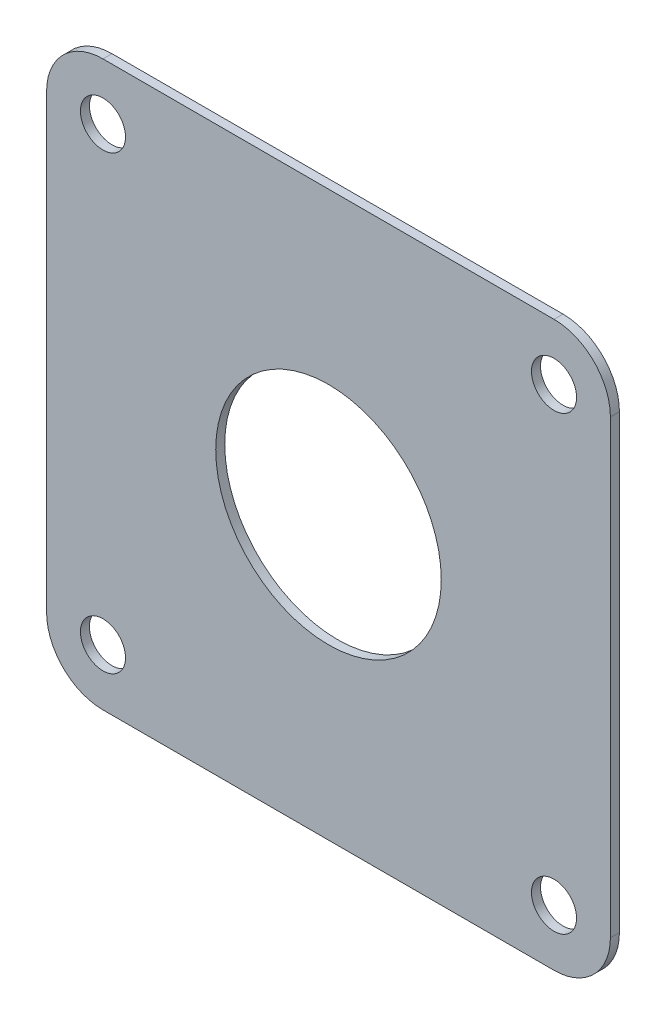
ISO-10303-21;
HEADER;
FILE_DESCRIPTION(('STEP AP214'),'2;1');
FILE_NAME('part.step','',(''),(''),'','','');
FILE_SCHEMA(('AUTOMOTIVE_DESIGN { 1 0 10303 214 1 1 1 1 }'));
ENDSEC;
DATA;
#1=APPLICATION_CONTEXT('core data for automotive mechanical design processes');
#2=APPLICATION_PROTOCOL_DEFINITION('international standard','automotive_design',2000,#1);
#3=PRODUCT_CONTEXT('',#1,'mechanical');
#4=PRODUCT('Part','Part','',(#3));
#5=PRODUCT_RELATED_PRODUCT_CATEGORY('part','',(#4));
#6=PRODUCT_DEFINITION_FORMATION('','',#4);
#7=PRODUCT_DEFINITION_CONTEXT('part definition',#1,'design');
#8=PRODUCT_DEFINITION('design','',#6,#7);
#9=PRODUCT_DEFINITION_SHAPE('','',#8);
#10=(LENGTH_UNIT() NAMED_UNIT(*) SI_UNIT(.MILLI.,.METRE.));
#11=(NAMED_UNIT(*) PLANE_ANGLE_UNIT() SI_UNIT($,.RADIAN.));
#12=(NAMED_UNIT(*) SI_UNIT($,.STERADIAN.) SOLID_ANGLE_UNIT());
#13=UNCERTAINTY_MEASURE_WITH_UNIT(LENGTH_MEASURE(1.E-05),#10,'distance_accuracy_value','');
#14=(GEOMETRIC_REPRESENTATION_CONTEXT(3) GLOBAL_UNCERTAINTY_ASSIGNED_CONTEXT((#13)) GLOBAL_UNIT_ASSIGNED_CONTEXT((#10,
#11,#12)) REPRESENTATION_CONTEXT('',''));
#15=CARTESIAN_POINT('',(0.,0.,0.));
#16=DIRECTION('',(0.,0.,1.));
#17=DIRECTION('',(1.,0.,0.));
#18=AXIS2_PLACEMENT_3D('',#15,#16,#17);
#19=CARTESIAN_POINT('',(25.,25.,0.8));
#20=DIRECTION('',(-1.,0.,0.));
#21=DIRECTION('',(0.,-1.,0.));
#22=AXIS2_PLACEMENT_3D('',#19,#20,#21);
#23=PLANE('',#22);
#24=DIRECTION('',(0.,1.,0.));
#25=VECTOR('',#24,1.);
#26=CARTESIAN_POINT('',(25.,25.,0.8));
#27=LINE('',#26,#25);
#28=CARTESIAN_POINT('',(25.,-20.,0.8));
#29=VERTEX_POINT('',#28);
#30=CARTESIAN_POINT('',(25.,20.,0.8));
#31=VERTEX_POINT('',#30);
#32=EDGE_CURVE('E128',#29,#31,#27,.T.);
#33=ORIENTED_EDGE('',*,*,#32,.F.);
#34=DIRECTION('',(0.,0.,-1.));
#35=VECTOR('',#34,1.);
#36=CARTESIAN_POINT('',(25.,-20.,0.8));
#37=LINE('',#36,#35);
#38=CARTESIAN_POINT('',(25.,-20.,0.));
#39=VERTEX_POINT('',#38);
#40=EDGE_CURVE('E154',#29,#39,#37,.T.);
#41=ORIENTED_EDGE('',*,*,#40,.T.);
#42=DIRECTION('',(0.,1.,0.));
#43=VECTOR('',#42,1.);
#44=CARTESIAN_POINT('',(25.,25.,0.));
#45=LINE('',#44,#43);
#46=CARTESIAN_POINT('',(25.,20.,0.));
#47=VERTEX_POINT('',#46);
#48=EDGE_CURVE('E163',#39,#47,#45,.T.);
#49=ORIENTED_EDGE('',*,*,#48,.T.);
#50=DIRECTION('',(0.,0.,-1.));
#51=VECTOR('',#50,1.);
#52=CARTESIAN_POINT('',(25.,20.,0.8));
#53=LINE('',#52,#51);
#54=EDGE_CURVE('E152',#47,#31,#53,.F.);
#55=ORIENTED_EDGE('',*,*,#54,.T.);
#56=EDGE_LOOP('',(#33,#41,#49,#55));
#57=FACE_BOUND('',#56,.T.);
#58=ADVANCED_FACE('F35',(#57),#23,.F.);
#59=CARTESIAN_POINT('',(-25.,25.,0.8));
#60=DIRECTION('',(0.,-1.,0.));
#61=DIRECTION('',(0.,0.,-1.));
#62=AXIS2_PLACEMENT_3D('',#59,#60,#61);
#63=PLANE('',#62);
#64=DIRECTION('',(-1.,0.,0.));
#65=VECTOR('',#64,1.);
#66=CARTESIAN_POINT('',(-25.,25.,0.8));
#67=LINE('',#66,#65);
#68=CARTESIAN_POINT('',(20.,25.,0.8));
#69=VERTEX_POINT('',#68);
#70=CARTESIAN_POINT('',(-20.,25.,0.8));
#71=VERTEX_POINT('',#70);
#72=EDGE_CURVE('E131',#69,#71,#67,.T.);
#73=ORIENTED_EDGE('',*,*,#72,.F.);
#74=DIRECTION('',(0.,0.,-1.));
#75=VECTOR('',#74,1.);
#76=CARTESIAN_POINT('',(20.,25.,0.8));
#77=LINE('',#76,#75);
#78=CARTESIAN_POINT('',(20.,25.,0.));
#79=VERTEX_POINT('',#78);
#80=EDGE_CURVE('E43',#69,#79,#77,.T.);
#81=ORIENTED_EDGE('',*,*,#80,.T.);
#82=DIRECTION('',(-1.,0.,0.));
#83=VECTOR('',#82,1.);
#84=CARTESIAN_POINT('',(-25.,25.,0.));
#85=LINE('',#84,#83);
#86=CARTESIAN_POINT('',(-20.,25.,0.));
#87=VERTEX_POINT('',#86);
#88=EDGE_CURVE('E133',#79,#87,#85,.T.);
#89=ORIENTED_EDGE('',*,*,#88,.T.);
#90=DIRECTION('',(0.,0.,-1.));
#91=VECTOR('',#90,1.);
#92=CARTESIAN_POINT('',(-20.,25.,0.8));
#93=LINE('',#92,#91);
#94=EDGE_CURVE('E50',#87,#71,#93,.F.);
#95=ORIENTED_EDGE('',*,*,#94,.T.);
#96=EDGE_LOOP('',(#73,#81,#89,#95));
#97=FACE_BOUND('',#96,.T.);
#98=ADVANCED_FACE('F160',(#97),#63,.F.);
#99=CARTESIAN_POINT('',(-25.,25.,0.8));
#100=DIRECTION('',(1.,0.,0.));
#101=DIRECTION('',(0.,1.,0.));
#102=AXIS2_PLACEMENT_3D('',#99,#100,#101);
#103=PLANE('',#102);
#104=DIRECTION('',(0.,-1.,0.));
#105=VECTOR('',#104,1.);
#106=CARTESIAN_POINT('',(-25.,25.,0.));
#107=LINE('',#106,#105);
#108=CARTESIAN_POINT('',(-25.,20.,0.));
#109=VERTEX_POINT('',#108);
#110=CARTESIAN_POINT('',(-25.,-20.,0.));
#111=VERTEX_POINT('',#110);
#112=EDGE_CURVE('E129',#109,#111,#107,.T.);
#113=ORIENTED_EDGE('',*,*,#112,.T.);
#114=DIRECTION('',(0.,0.,-1.));
#115=VECTOR('',#114,1.);
#116=CARTESIAN_POINT('',(-25.,-20.,0.8));
#117=LINE('',#116,#115);
#118=CARTESIAN_POINT('',(-25.,-20.,0.8));
#119=VERTEX_POINT('',#118);
#120=EDGE_CURVE('E107',#111,#119,#117,.F.);
#121=ORIENTED_EDGE('',*,*,#120,.T.);
#122=DIRECTION('',(0.,-1.,0.));
#123=VECTOR('',#122,1.);
#124=CARTESIAN_POINT('',(-25.,25.,0.8));
#125=LINE('',#124,#123);
#126=CARTESIAN_POINT('',(-25.,20.,0.8));
#127=VERTEX_POINT('',#126);
#128=EDGE_CURVE('E168',#127,#119,#125,.T.);
#129=ORIENTED_EDGE('',*,*,#128,.F.);
#130=DIRECTION('',(0.,0.,-1.));
#131=VECTOR('',#130,1.);
#132=CARTESIAN_POINT('',(-25.,20.,0.8));
#133=LINE('',#132,#131);
#134=EDGE_CURVE('E112',#127,#109,#133,.T.);
#135=ORIENTED_EDGE('',*,*,#134,.T.);
#136=EDGE_LOOP('',(#113,#121,#129,#135));
#137=FACE_BOUND('',#136,.T.);
#138=ADVANCED_FACE('F279',(#137),#103,.F.);
#139=CARTESIAN_POINT('',(-25.,-25.,0.8));
#140=DIRECTION('',(0.,1.,0.));
#141=DIRECTION('',(0.,0.,1.));
#142=AXIS2_PLACEMENT_3D('',#139,#140,#141);
#143=PLANE('',#142);
#144=DIRECTION('',(1.,0.,0.));
#145=VECTOR('',#144,1.);
#146=CARTESIAN_POINT('',(-25.,-25.,0.8));
#147=LINE('',#146,#145);
#148=CARTESIAN_POINT('',(-20.,-25.,0.8));
#149=VERTEX_POINT('',#148);
#150=CARTESIAN_POINT('',(20.,-25.,0.8));
#151=VERTEX_POINT('',#150);
#152=EDGE_CURVE('E122',#149,#151,#147,.T.);
#153=ORIENTED_EDGE('',*,*,#152,.F.);
#154=DIRECTION('',(0.,0.,-1.));
#155=VECTOR('',#154,1.);
#156=CARTESIAN_POINT('',(-20.,-25.,0.8));
#157=LINE('',#156,#155);
#158=CARTESIAN_POINT('',(-20.,-25.,0.));
#159=VERTEX_POINT('',#158);
#160=EDGE_CURVE('E106',#149,#159,#157,.T.);
#161=ORIENTED_EDGE('',*,*,#160,.T.);
#162=DIRECTION('',(1.,0.,0.));
#163=VECTOR('',#162,1.);
#164=CARTESIAN_POINT('',(-25.,-25.,0.));
#165=LINE('',#164,#163);
#166=CARTESIAN_POINT('',(20.,-25.,0.));
#167=VERTEX_POINT('',#166);
#168=EDGE_CURVE('E119',#159,#167,#165,.T.);
#169=ORIENTED_EDGE('',*,*,#168,.T.);
#170=DIRECTION('',(0.,0.,-1.));
#171=VECTOR('',#170,1.);
#172=CARTESIAN_POINT('',(20.,-25.,0.8));
#173=LINE('',#172,#171);
#174=EDGE_CURVE('E124',#167,#151,#173,.F.);
#175=ORIENTED_EDGE('',*,*,#174,.T.);
#176=EDGE_LOOP('',(#153,#161,#169,#175));
#177=FACE_BOUND('',#176,.T.);
#178=ADVANCED_FACE('F118',(#177),#143,.F.);
#179=CARTESIAN_POINT('',(0.,0.,0.8));
#180=DIRECTION('',(0.,0.,1.));
#181=DIRECTION('',(1.,0.,0.));
#182=AXIS2_PLACEMENT_3D('',#179,#180,#181);
#183=PLANE('',#182);
#184=CARTESIAN_POINT('',(0.,0.,0.8));
#185=DIRECTION('',(0.,0.,-1.));
#186=DIRECTION('',(-1.,0.,0.));
#187=AXIS2_PLACEMENT_3D('',#184,#185,#186);
#188=CIRCLE('',#187,10.);
#189=CARTESIAN_POINT('',(-10.,0.,0.8));
#190=VERTEX_POINT('',#189);
#191=EDGE_CURVE('E202',#190,#190,#188,.T.);
#192=ORIENTED_EDGE('',*,*,#191,.T.);
#193=EDGE_LOOP('',(#192));
#194=FACE_BOUND('',#193,.T.);
#195=CARTESIAN_POINT('',(20.,-20.,0.8));
#196=DIRECTION('',(0.,0.,-1.));
#197=DIRECTION('',(-1.,0.,0.));
#198=AXIS2_PLACEMENT_3D('',#195,#196,#197);
#199=CIRCLE('',#198,2.);
#200=CARTESIAN_POINT('',(18.,-20.,0.8));
#201=VERTEX_POINT('',#200);
#202=EDGE_CURVE('E181',#201,#201,#199,.T.);
#203=ORIENTED_EDGE('',*,*,#202,.T.);
#204=EDGE_LOOP('',(#203));
#205=FACE_BOUND('',#204,.T.);
#206=CARTESIAN_POINT('',(-20.,-20.,0.8));
#207=DIRECTION('',(0.,0.,-1.));
#208=DIRECTION('',(-1.,0.,0.));
#209=AXIS2_PLACEMENT_3D('',#206,#207,#208);
#210=CIRCLE('',#209,2.);
#211=CARTESIAN_POINT('',(-22.,-20.,0.8));
#212=VERTEX_POINT('',#211);
#213=EDGE_CURVE('E188',#212,#212,#210,.T.);
#214=ORIENTED_EDGE('',*,*,#213,.T.);
#215=EDGE_LOOP('',(#214));
#216=FACE_BOUND('',#215,.T.);
#217=CARTESIAN_POINT('',(-20.,20.,0.8));
#218=DIRECTION('',(0.,0.,-1.));
#219=DIRECTION('',(-1.,0.,0.));
#220=AXIS2_PLACEMENT_3D('',#217,#218,#219);
#221=CIRCLE('',#220,2.);
#222=CARTESIAN_POINT('',(-22.,20.,0.8));
#223=VERTEX_POINT('',#222);
#224=EDGE_CURVE('E175',#223,#223,#221,.T.);
#225=ORIENTED_EDGE('',*,*,#224,.T.);
#226=EDGE_LOOP('',(#225));
#227=FACE_BOUND('',#226,.T.);
#228=CARTESIAN_POINT('',(20.,20.,0.8));
#229=DIRECTION('',(0.,0.,-1.));
#230=DIRECTION('',(-1.,0.,0.));
#231=AXIS2_PLACEMENT_3D('',#228,#229,#230);
#232=CIRCLE('',#231,2.);
#233=CARTESIAN_POINT('',(18.,20.,0.8));
#234=VERTEX_POINT('',#233);
#235=EDGE_CURVE('E164',#234,#234,#232,.T.);
#236=ORIENTED_EDGE('',*,*,#235,.T.);
#237=EDGE_LOOP('',(#236));
#238=FACE_BOUND('',#237,.T.);
#239=ORIENTED_EDGE('',*,*,#128,.T.);
#240=CARTESIAN_POINT('',(-20.,-20.,0.8));
#241=DIRECTION('',(0.,0.,1.));
#242=DIRECTION('',(1.,0.,0.));
#243=AXIS2_PLACEMENT_3D('',#240,#241,#242);
#244=CIRCLE('',#243,5.);
#245=EDGE_CURVE('E150',#119,#149,#244,.T.);
#246=ORIENTED_EDGE('',*,*,#245,.T.);
#247=ORIENTED_EDGE('',*,*,#152,.T.);
#248=CARTESIAN_POINT('',(20.,-20.,0.8));
#249=DIRECTION('',(0.,0.,1.));
#250=DIRECTION('',(1.,0.,0.));
#251=AXIS2_PLACEMENT_3D('',#248,#249,#250);
#252=CIRCLE('',#251,5.);
#253=EDGE_CURVE('E148',#151,#29,#252,.T.);
#254=ORIENTED_EDGE('',*,*,#253,.T.);
#255=ORIENTED_EDGE('',*,*,#32,.T.);
#256=CARTESIAN_POINT('',(20.,20.,0.8));
#257=DIRECTION('',(0.,0.,1.));
#258=DIRECTION('',(1.,0.,0.));
#259=AXIS2_PLACEMENT_3D('',#256,#257,#258);
#260=CIRCLE('',#259,5.);
#261=EDGE_CURVE('E57',#31,#69,#260,.T.);
#262=ORIENTED_EDGE('',*,*,#261,.T.);
#263=ORIENTED_EDGE('',*,*,#72,.T.);
#264=CARTESIAN_POINT('',(-20.,20.,0.8));
#265=DIRECTION('',(0.,0.,1.));
#266=DIRECTION('',(1.,0.,0.));
#267=AXIS2_PLACEMENT_3D('',#264,#265,#266);
#268=CIRCLE('',#267,5.);
#269=EDGE_CURVE('E145',#71,#127,#268,.T.);
#270=ORIENTED_EDGE('',*,*,#269,.T.);
#271=EDGE_LOOP('',(#239,#246,#247,#254,#255,#262,#263,#270));
#272=FACE_BOUND('',#271,.T.);
#273=ADVANCED_FACE('F211',(#194,#205,#216,#227,#238,#272),#183,.T.);
#274=CARTESIAN_POINT('',(0.,0.,0.));
#275=DIRECTION('',(0.,0.,1.));
#276=DIRECTION('',(1.,0.,0.));
#277=AXIS2_PLACEMENT_3D('',#274,#275,#276);
#278=PLANE('',#277);
#279=CARTESIAN_POINT('',(0.,0.,0.));
#280=DIRECTION('',(0.,0.,1.));
#281=DIRECTION('',(1.,0.,0.));
#282=AXIS2_PLACEMENT_3D('',#279,#280,#281);
#283=CIRCLE('',#282,19.8071873889356);
#284=CARTESIAN_POINT('',(19.8071873889356,0.,0.));
#285=VERTEX_POINT('',#284);
#286=EDGE_CURVE('E11',#285,#285,#283,.F.);
#287=ORIENTED_EDGE('',*,*,#286,.F.);
#288=EDGE_LOOP('',(#287));
#289=FACE_BOUND('',#288,.T.);
#290=CARTESIAN_POINT('',(20.,-20.,0.));
#291=DIRECTION('',(0.,0.,-1.));
#292=DIRECTION('',(-1.,0.,0.));
#293=AXIS2_PLACEMENT_3D('',#290,#291,#292);
#294=CIRCLE('',#293,2.);
#295=CARTESIAN_POINT('',(18.,-20.,0.));
#296=VERTEX_POINT('',#295);
#297=EDGE_CURVE('E178',#296,#296,#294,.T.);
#298=ORIENTED_EDGE('',*,*,#297,.F.);
#299=EDGE_LOOP('',(#298));
#300=FACE_BOUND('',#299,.T.);
#301=CARTESIAN_POINT('',(-20.,-20.,0.));
#302=DIRECTION('',(0.,0.,-1.));
#303=DIRECTION('',(-1.,0.,0.));
#304=AXIS2_PLACEMENT_3D('',#301,#302,#303);
#305=CIRCLE('',#304,2.);
#306=CARTESIAN_POINT('',(-22.,-20.,0.));
#307=VERTEX_POINT('',#306);
#308=EDGE_CURVE('E185',#307,#307,#305,.T.);
#309=ORIENTED_EDGE('',*,*,#308,.F.);
#310=EDGE_LOOP('',(#309));
#311=FACE_BOUND('',#310,.T.);
#312=CARTESIAN_POINT('',(-20.,20.,0.));
#313=DIRECTION('',(0.,0.,-1.));
#314=DIRECTION('',(-1.,0.,0.));
#315=AXIS2_PLACEMENT_3D('',#312,#313,#314);
#316=CIRCLE('',#315,2.);
#317=CARTESIAN_POINT('',(-22.,20.,0.));
#318=VERTEX_POINT('',#317);
#319=EDGE_CURVE('E191',#318,#318,#316,.T.);
#320=ORIENTED_EDGE('',*,*,#319,.F.);
#321=EDGE_LOOP('',(#320));
#322=FACE_BOUND('',#321,.T.);
#323=CARTESIAN_POINT('',(20.,20.,0.));
#324=DIRECTION('',(0.,0.,-1.));
#325=DIRECTION('',(-1.,0.,0.));
#326=AXIS2_PLACEMENT_3D('',#323,#324,#325);
#327=CIRCLE('',#326,2.);
#328=CARTESIAN_POINT('',(18.,20.,0.));
#329=VERTEX_POINT('',#328);
#330=EDGE_CURVE('E172',#329,#329,#327,.T.);
#331=ORIENTED_EDGE('',*,*,#330,.F.);
#332=EDGE_LOOP('',(#331));
#333=FACE_BOUND('',#332,.T.);
#334=ORIENTED_EDGE('',*,*,#168,.F.);
#335=CARTESIAN_POINT('',(-20.,-20.,0.));
#336=DIRECTION('',(0.,0.,1.));
#337=DIRECTION('',(1.,0.,0.));
#338=AXIS2_PLACEMENT_3D('',#335,#336,#337);
#339=CIRCLE('',#338,5.);
#340=EDGE_CURVE('E102',#159,#111,#339,.F.);
#341=ORIENTED_EDGE('',*,*,#340,.T.);
#342=ORIENTED_EDGE('',*,*,#112,.F.);
#343=CARTESIAN_POINT('',(-20.,20.,0.));
#344=DIRECTION('',(0.,0.,1.));
#345=DIRECTION('',(1.,0.,0.));
#346=AXIS2_PLACEMENT_3D('',#343,#344,#345);
#347=CIRCLE('',#346,5.);
#348=EDGE_CURVE('E123',#109,#87,#347,.F.);
#349=ORIENTED_EDGE('',*,*,#348,.T.);
#350=ORIENTED_EDGE('',*,*,#88,.F.);
#351=CARTESIAN_POINT('',(20.,20.,0.));
#352=DIRECTION('',(0.,0.,1.));
#353=DIRECTION('',(1.,0.,0.));
#354=AXIS2_PLACEMENT_3D('',#351,#352,#353);
#355=CIRCLE('',#354,5.);
#356=EDGE_CURVE('E139',#79,#47,#355,.F.);
#357=ORIENTED_EDGE('',*,*,#356,.T.);
#358=ORIENTED_EDGE('',*,*,#48,.F.);
#359=CARTESIAN_POINT('',(20.,-20.,0.));
#360=DIRECTION('',(0.,0.,1.));
#361=DIRECTION('',(1.,0.,0.));
#362=AXIS2_PLACEMENT_3D('',#359,#360,#361);
#363=CIRCLE('',#362,5.);
#364=EDGE_CURVE('E113',#39,#167,#363,.F.);
#365=ORIENTED_EDGE('',*,*,#364,.T.);
#366=EDGE_LOOP('',(#334,#341,#342,#349,#350,#357,#358,#365));
#367=FACE_BOUND('',#366,.T.);
#368=ADVANCED_FACE('F126',(#289,#300,#311,#322,#333,#367),#278,.F.);
#369=CARTESIAN_POINT('',(-20.,-20.,0.8));
#370=DIRECTION('',(0.,0.,-1.));
#371=DIRECTION('',(-1.,0.,0.));
#372=AXIS2_PLACEMENT_3D('',#369,#370,#371);
#373=CYLINDRICAL_SURFACE('',#372,5.);
#374=ORIENTED_EDGE('',*,*,#245,.F.);
#375=ORIENTED_EDGE('',*,*,#120,.F.);
#376=ORIENTED_EDGE('',*,*,#340,.F.);
#377=ORIENTED_EDGE('',*,*,#160,.F.);
#378=EDGE_LOOP('',(#374,#375,#376,#377));
#379=FACE_BOUND('',#378,.T.);
#380=ADVANCED_FACE('F105',(#379),#373,.T.);
#381=CARTESIAN_POINT('',(20.,-20.,0.8));
#382=DIRECTION('',(0.,0.,-1.));
#383=DIRECTION('',(-1.,0.,0.));
#384=AXIS2_PLACEMENT_3D('',#381,#382,#383);
#385=CYLINDRICAL_SURFACE('',#384,5.);
#386=ORIENTED_EDGE('',*,*,#253,.F.);
#387=ORIENTED_EDGE('',*,*,#174,.F.);
#388=ORIENTED_EDGE('',*,*,#364,.F.);
#389=ORIENTED_EDGE('',*,*,#40,.F.);
#390=EDGE_LOOP('',(#386,#387,#388,#389));
#391=FACE_BOUND('',#390,.T.);
#392=ADVANCED_FACE('F286',(#391),#385,.T.);
#393=CARTESIAN_POINT('',(20.,20.,0.8));
#394=DIRECTION('',(0.,0.,-1.));
#395=DIRECTION('',(-1.,0.,0.));
#396=AXIS2_PLACEMENT_3D('',#393,#394,#395);
#397=CYLINDRICAL_SURFACE('',#396,5.);
#398=ORIENTED_EDGE('',*,*,#261,.F.);
#399=ORIENTED_EDGE('',*,*,#54,.F.);
#400=ORIENTED_EDGE('',*,*,#356,.F.);
#401=ORIENTED_EDGE('',*,*,#80,.F.);
#402=EDGE_LOOP('',(#398,#399,#400,#401));
#403=FACE_BOUND('',#402,.T.);
#404=ADVANCED_FACE('F268',(#403),#397,.T.);
#405=CARTESIAN_POINT('',(-20.,20.,0.8));
#406=DIRECTION('',(0.,0.,-1.));
#407=DIRECTION('',(-1.,0.,0.));
#408=AXIS2_PLACEMENT_3D('',#405,#406,#407);
#409=CYLINDRICAL_SURFACE('',#408,5.);
#410=ORIENTED_EDGE('',*,*,#269,.F.);
#411=ORIENTED_EDGE('',*,*,#94,.F.);
#412=ORIENTED_EDGE('',*,*,#348,.F.);
#413=ORIENTED_EDGE('',*,*,#134,.F.);
#414=EDGE_LOOP('',(#410,#411,#412,#413));
#415=FACE_BOUND('',#414,.T.);
#416=ADVANCED_FACE('F37',(#415),#409,.T.);
#417=CARTESIAN_POINT('',(20.,20.,0.8));
#418=DIRECTION('',(0.,0.,-1.));
#419=DIRECTION('',(-1.,0.,0.));
#420=AXIS2_PLACEMENT_3D('',#417,#418,#419);
#421=CYLINDRICAL_SURFACE('',#420,2.);
#422=ORIENTED_EDGE('',*,*,#235,.F.);
#423=EDGE_LOOP('',(#422));
#424=FACE_BOUND('',#423,.T.);
#425=ORIENTED_EDGE('',*,*,#330,.T.);
#426=EDGE_LOOP('',(#425));
#427=FACE_BOUND('',#426,.T.);
#428=ADVANCED_FACE('F256',(#424,#427),#421,.F.);
#429=CARTESIAN_POINT('',(-20.,20.,0.8));
#430=DIRECTION('',(0.,0.,-1.));
#431=DIRECTION('',(-1.,0.,0.));
#432=AXIS2_PLACEMENT_3D('',#429,#430,#431);
#433=CYLINDRICAL_SURFACE('',#432,2.);
#434=ORIENTED_EDGE('',*,*,#224,.F.);
#435=EDGE_LOOP('',(#434));
#436=FACE_BOUND('',#435,.T.);
#437=ORIENTED_EDGE('',*,*,#319,.T.);
#438=EDGE_LOOP('',(#437));
#439=FACE_BOUND('',#438,.T.);
#440=ADVANCED_FACE('F258',(#436,#439),#433,.F.);
#441=CARTESIAN_POINT('',(-20.,-20.,0.8));
#442=DIRECTION('',(0.,0.,-1.));
#443=DIRECTION('',(-1.,0.,0.));
#444=AXIS2_PLACEMENT_3D('',#441,#442,#443);
#445=CYLINDRICAL_SURFACE('',#444,2.);
#446=ORIENTED_EDGE('',*,*,#213,.F.);
#447=EDGE_LOOP('',(#446));
#448=FACE_BOUND('',#447,.T.);
#449=ORIENTED_EDGE('',*,*,#308,.T.);
#450=EDGE_LOOP('',(#449));
#451=FACE_BOUND('',#450,.T.);
#452=ADVANCED_FACE('F265',(#448,#451),#445,.F.);
#453=CARTESIAN_POINT('',(20.,-20.,0.8));
#454=DIRECTION('',(0.,0.,-1.));
#455=DIRECTION('',(-1.,0.,0.));
#456=AXIS2_PLACEMENT_3D('',#453,#454,#455);
#457=CYLINDRICAL_SURFACE('',#456,2.);
#458=ORIENTED_EDGE('',*,*,#202,.F.);
#459=EDGE_LOOP('',(#458));
#460=FACE_BOUND('',#459,.T.);
#461=ORIENTED_EDGE('',*,*,#297,.T.);
#462=EDGE_LOOP('',(#461));
#463=FACE_BOUND('',#462,.T.);
#464=ADVANCED_FACE('F241',(#460,#463),#457,.F.);
#465=CARTESIAN_POINT('',(0.,0.,-1.5));
#466=DIRECTION('',(0.,0.,1.));
#467=DIRECTION('',(1.,0.,0.));
#468=AXIS2_PLACEMENT_3D('',#465,#466,#467);
#469=CYLINDRICAL_SURFACE('',#468,19.8071873889356);
#470=CARTESIAN_POINT('',(0.,0.,-1.5));
#471=DIRECTION('',(0.,0.,-1.));
#472=DIRECTION('',(-1.,0.,0.));
#473=AXIS2_PLACEMENT_3D('',#470,#471,#472);
#474=CIRCLE('',#473,19.8071873889356);
#475=CARTESIAN_POINT('',(-19.8071873889356,0.,-1.5));
#476=VERTEX_POINT('',#475);
#477=EDGE_CURVE('E182',#476,#476,#474,.T.);
#478=ORIENTED_EDGE('',*,*,#477,.F.);
#479=EDGE_LOOP('',(#478));
#480=FACE_BOUND('',#479,.T.);
#481=ORIENTED_EDGE('',*,*,#286,.T.);
#482=EDGE_LOOP('',(#481));
#483=FACE_BOUND('',#482,.T.);
#484=ADVANCED_FACE('F235',(#480,#483),#469,.T.);
#485=CARTESIAN_POINT('',(0.,0.,-1.5));
#486=DIRECTION('',(0.,0.,-1.));
#487=DIRECTION('',(-1.,0.,0.));
#488=AXIS2_PLACEMENT_3D('',#485,#486,#487);
#489=PLANE('',#488);
#490=CARTESIAN_POINT('',(0.,0.,-1.5));
#491=DIRECTION('',(0.,0.,-1.));
#492=DIRECTION('',(-1.,0.,0.));
#493=AXIS2_PLACEMENT_3D('',#490,#491,#492);
#494=CIRCLE('',#493,17.5);
#495=CARTESIAN_POINT('',(-17.5,0.,-1.5));
#496=VERTEX_POINT('',#495);
#497=EDGE_CURVE('E199',#496,#496,#494,.T.);
#498=ORIENTED_EDGE('',*,*,#497,.F.);
#499=EDGE_LOOP('',(#498));
#500=FACE_BOUND('',#499,.T.);
#501=ORIENTED_EDGE('',*,*,#477,.T.);
#502=EDGE_LOOP('',(#501));
#503=FACE_BOUND('',#502,.T.);
#504=ADVANCED_FACE('F229',(#500,#503),#489,.T.);
#505=CARTESIAN_POINT('',(0.,0.,0.));
#506=DIRECTION('',(0.,0.,-1.));
#507=DIRECTION('',(-1.,0.,0.));
#508=AXIS2_PLACEMENT_3D('',#505,#506,#507);
#509=CYLINDRICAL_SURFACE('',#508,17.5);
#510=CARTESIAN_POINT('',(0.,0.,0.));
#511=DIRECTION('',(0.,0.,-1.));
#512=DIRECTION('',(-1.,0.,0.));
#513=AXIS2_PLACEMENT_3D('',#510,#511,#512);
#514=CIRCLE('',#513,17.5);
#515=CARTESIAN_POINT('',(-17.5,0.,0.));
#516=VERTEX_POINT('',#515);
#517=EDGE_CURVE('E198',#516,#516,#514,.T.);
#518=ORIENTED_EDGE('',*,*,#517,.F.);
#519=EDGE_LOOP('',(#518));
#520=FACE_BOUND('',#519,.T.);
#521=ORIENTED_EDGE('',*,*,#497,.T.);
#522=EDGE_LOOP('',(#521));
#523=FACE_BOUND('',#522,.T.);
#524=ADVANCED_FACE('F223',(#520,#523),#509,.F.);
#525=CARTESIAN_POINT('',(0.,0.,0.));
#526=DIRECTION('',(0.,0.,-1.));
#527=DIRECTION('',(-1.,0.,0.));
#528=AXIS2_PLACEMENT_3D('',#525,#526,#527);
#529=PLANE('',#528);
#530=CARTESIAN_POINT('',(0.,0.,0.));
#531=DIRECTION('',(0.,0.,-1.));
#532=DIRECTION('',(-1.,0.,0.));
#533=AXIS2_PLACEMENT_3D('',#530,#531,#532);
#534=CIRCLE('',#533,10.);
#535=CARTESIAN_POINT('',(-10.,0.,0.));
#536=VERTEX_POINT('',#535);
#537=EDGE_CURVE('E205',#536,#536,#534,.T.);
#538=ORIENTED_EDGE('',*,*,#537,.F.);
#539=EDGE_LOOP('',(#538));
#540=FACE_BOUND('',#539,.T.);
#541=ORIENTED_EDGE('',*,*,#517,.T.);
#542=EDGE_LOOP('',(#541));
#543=FACE_BOUND('',#542,.T.);
#544=ADVANCED_FACE('F217',(#540,#543),#529,.T.);
#545=CARTESIAN_POINT('',(0.,0.,0.8));
#546=DIRECTION('',(0.,0.,-1.));
#547=DIRECTION('',(-1.,0.,0.));
#548=AXIS2_PLACEMENT_3D('',#545,#546,#547);
#549=CYLINDRICAL_SURFACE('',#548,10.);
#550=ORIENTED_EDGE('',*,*,#191,.F.);
#551=EDGE_LOOP('',(#550));
#552=FACE_BOUND('',#551,.T.);
#553=ORIENTED_EDGE('',*,*,#537,.T.);
#554=EDGE_LOOP('',(#553));
#555=FACE_BOUND('',#554,.T.);
#556=ADVANCED_FACE('F214',(#552,#555),#549,.F.);
#557=CLOSED_SHELL('',(#58,#98,#138,#178,#273,#368,#380,#392,#404,#416,#428,#440,#452,#464,#484,
#504,#524,#544,#556));
#558=MANIFOLD_SOLID_BREP('B2',#557);
#559=ADVANCED_BREP_SHAPE_REPRESENTATION('',(#18,#558),#14);
#560=SHAPE_DEFINITION_REPRESENTATION(#9,#559);
ENDSEC;
END-ISO-10303-21;
